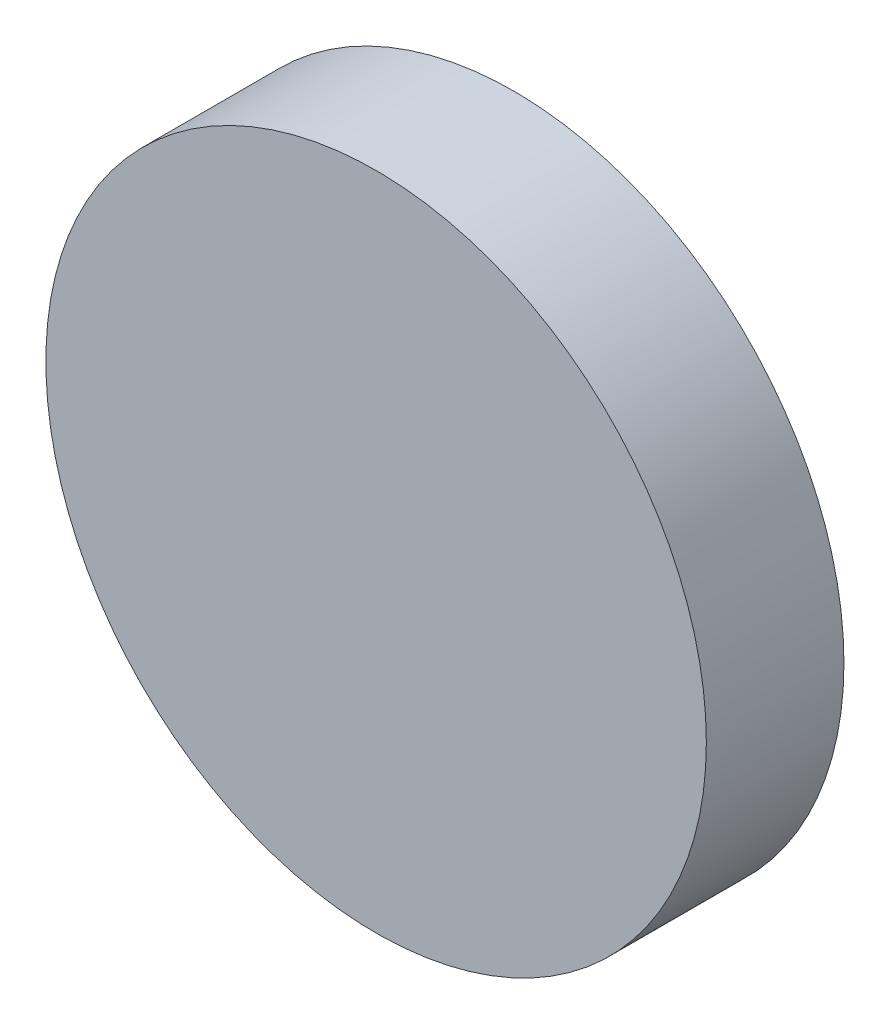
ISO-10303-21;
HEADER;
FILE_DESCRIPTION(('STEP AP214'),'2;1');
FILE_NAME('part.step','',(''),(''),'','','');
FILE_SCHEMA(('AUTOMOTIVE_DESIGN { 1 0 10303 214 1 1 1 1 }'));
ENDSEC;
DATA;
#1=APPLICATION_CONTEXT('core data for automotive mechanical design processes');
#2=APPLICATION_PROTOCOL_DEFINITION('international standard','automotive_design',2000,#1);
#3=PRODUCT_CONTEXT('',#1,'mechanical');
#4=PRODUCT('Part','Part','',(#3));
#5=PRODUCT_RELATED_PRODUCT_CATEGORY('part','',(#4));
#6=PRODUCT_DEFINITION_FORMATION('','',#4);
#7=PRODUCT_DEFINITION_CONTEXT('part definition',#1,'design');
#8=PRODUCT_DEFINITION('design','',#6,#7);
#9=PRODUCT_DEFINITION_SHAPE('','',#8);
#10=(LENGTH_UNIT() NAMED_UNIT(*) SI_UNIT(.MILLI.,.METRE.));
#11=(NAMED_UNIT(*) PLANE_ANGLE_UNIT() SI_UNIT($,.RADIAN.));
#12=(NAMED_UNIT(*) SI_UNIT($,.STERADIAN.) SOLID_ANGLE_UNIT());
#13=UNCERTAINTY_MEASURE_WITH_UNIT(LENGTH_MEASURE(1.E-05),#10,'distance_accuracy_value','');
#14=(GEOMETRIC_REPRESENTATION_CONTEXT(3) GLOBAL_UNCERTAINTY_ASSIGNED_CONTEXT((#13)) GLOBAL_UNIT_ASSIGNED_CONTEXT((#10,
#11,#12)) REPRESENTATION_CONTEXT('',''));
#15=CARTESIAN_POINT('',(0.,0.,0.));
#16=DIRECTION('',(0.,0.,1.));
#17=DIRECTION('',(1.,0.,0.));
#18=AXIS2_PLACEMENT_3D('',#15,#16,#17);
#19=CARTESIAN_POINT('',(0.,0.,10.));
#20=DIRECTION('',(0.,0.,-1.));
#21=DIRECTION('',(-1.,0.,0.));
#22=AXIS2_PLACEMENT_3D('',#19,#20,#21);
#23=CYLINDRICAL_SURFACE('',#22,24.);
#24=CARTESIAN_POINT('',(0.,0.,10.));
#25=DIRECTION('',(0.,0.,1.));
#26=DIRECTION('',(1.,0.,0.));
#27=AXIS2_PLACEMENT_3D('',#24,#25,#26);
#28=CIRCLE('',#27,24.);
#29=CARTESIAN_POINT('',(24.,0.,10.));
#30=VERTEX_POINT('',#29);
#31=EDGE_CURVE('E78',#30,#30,#28,.T.);
#32=ORIENTED_EDGE('',*,*,#31,.F.);
#33=EDGE_LOOP('',(#32));
#34=FACE_BOUND('',#33,.T.);
#35=CARTESIAN_POINT('',(0.,0.,0.));
#36=DIRECTION('',(0.,0.,1.));
#37=DIRECTION('',(1.,0.,0.));
#38=AXIS2_PLACEMENT_3D('',#35,#36,#37);
#39=CIRCLE('',#38,24.);
#40=CARTESIAN_POINT('',(24.,0.,0.));
#41=VERTEX_POINT('',#40);
#42=EDGE_CURVE('E79',#41,#41,#39,.T.);
#43=ORIENTED_EDGE('',*,*,#42,.T.);
#44=EDGE_LOOP('',(#43));
#45=FACE_BOUND('',#44,.T.);
#46=ADVANCED_FACE('F38',(#34,#45),#23,.T.);
#47=CARTESIAN_POINT('',(0.,0.,10.));
#48=DIRECTION('',(0.,0.,1.));
#49=DIRECTION('',(1.,0.,0.));
#50=AXIS2_PLACEMENT_3D('',#47,#48,#49);
#51=PLANE('',#50);
#52=ORIENTED_EDGE('',*,*,#31,.T.);
#53=EDGE_LOOP('',(#52));
#54=FACE_BOUND('',#53,.T.);
#55=ADVANCED_FACE('F85',(#54),#51,.T.);
#56=CARTESIAN_POINT('',(0.,0.,0.));
#57=DIRECTION('',(0.,0.,1.));
#58=DIRECTION('',(1.,0.,0.));
#59=AXIS2_PLACEMENT_3D('',#56,#57,#58);
#60=PLANE('',#59);
#61=CARTESIAN_POINT('',(15.8155664172263,-10.164047368165,0.));
#62=DIRECTION('',(0.,0.,1.));
#63=DIRECTION('',(1.,0.,0.));
#64=AXIS2_PLACEMENT_3D('',#61,#62,#63);
#65=CIRCLE('',#64,2.);
#66=CARTESIAN_POINT('',(17.8155664172263,-10.164047368165,0.));
#67=VERTEX_POINT('',#66);
#68=EDGE_CURVE('E11',#67,#67,#65,.F.);
#69=ORIENTED_EDGE('',*,*,#68,.F.);
#70=EDGE_LOOP('',(#69));
#71=FACE_BOUND('',#70,.T.);
#72=CARTESIAN_POINT('',(7.80980224443567,-17.1010815126649,0.));
#73=DIRECTION('',(0.,0.,1.));
#74=DIRECTION('',(1.,0.,0.));
#75=AXIS2_PLACEMENT_3D('',#72,#73,#74);
#76=CIRCLE('',#75,2.);
#77=CARTESIAN_POINT('',(9.80980224443567,-17.1010815126649,0.));
#78=VERTEX_POINT('',#77);
#79=EDGE_CURVE('E44',#78,#78,#76,.F.);
#80=ORIENTED_EDGE('',*,*,#79,.F.);
#81=EDGE_LOOP('',(#80));
#82=FACE_BOUND('',#81,.T.);
#83=CARTESIAN_POINT('',(-2.67551895953756,-18.6086431073616,0.));
#84=DIRECTION('',(0.,0.,1.));
#85=DIRECTION('',(1.,0.,0.));
#86=AXIS2_PLACEMENT_3D('',#83,#84,#85);
#87=CIRCLE('',#86,2.);
#88=CARTESIAN_POINT('',(-0.675518959537561,-18.6086431073616,0.));
#89=VERTEX_POINT('',#88);
#90=EDGE_CURVE('E48',#89,#89,#87,.F.);
#91=ORIENTED_EDGE('',*,*,#90,.F.);
#92=EDGE_LOOP('',(#91));
#93=FACE_BOUND('',#92,.T.);
#94=CARTESIAN_POINT('',(-12.3113817981712,-14.2080919978602,0.));
#95=DIRECTION('',(0.,0.,1.));
#96=DIRECTION('',(1.,0.,0.));
#97=AXIS2_PLACEMENT_3D('',#94,#95,#96);
#98=CIRCLE('',#97,2.);
#99=CARTESIAN_POINT('',(-10.3113817981712,-14.2080919978602,0.));
#100=VERTEX_POINT('',#99);
#101=EDGE_CURVE('E52',#100,#100,#98,.F.);
#102=ORIENTED_EDGE('',*,*,#101,.F.);
#103=EDGE_LOOP('',(#102));
#104=FACE_BOUND('',#103,.T.);
#105=CARTESIAN_POINT('',(-18.0384679039525,-5.29657206861902,0.));
#106=DIRECTION('',(0.,0.,1.));
#107=DIRECTION('',(1.,0.,0.));
#108=AXIS2_PLACEMENT_3D('',#105,#106,#107);
#109=CIRCLE('',#108,2.);
#110=CARTESIAN_POINT('',(-16.0384679039525,-5.29657206861902,0.));
#111=VERTEX_POINT('',#110);
#112=EDGE_CURVE('E57',#111,#111,#109,.F.);
#113=ORIENTED_EDGE('',*,*,#112,.F.);
#114=EDGE_LOOP('',(#113));
#115=FACE_BOUND('',#114,.T.);
#116=CARTESIAN_POINT('',(-18.0384679039526,5.29657206861876,0.));
#117=DIRECTION('',(0.,0.,1.));
#118=DIRECTION('',(1.,0.,0.));
#119=AXIS2_PLACEMENT_3D('',#116,#117,#118);
#120=CIRCLE('',#119,2.);
#121=CARTESIAN_POINT('',(-16.0384679039526,5.29657206861876,0.));
#122=VERTEX_POINT('',#121);
#123=EDGE_CURVE('E60',#122,#122,#120,.F.);
#124=ORIENTED_EDGE('',*,*,#123,.F.);
#125=EDGE_LOOP('',(#124));
#126=FACE_BOUND('',#125,.T.);
#127=CARTESIAN_POINT('',(-12.3113817981714,14.20809199786,0.));
#128=DIRECTION('',(0.,0.,1.));
#129=DIRECTION('',(1.,0.,0.));
#130=AXIS2_PLACEMENT_3D('',#127,#128,#129);
#131=CIRCLE('',#130,2.);
#132=CARTESIAN_POINT('',(-10.3113817981714,14.20809199786,0.));
#133=VERTEX_POINT('',#132);
#134=EDGE_CURVE('E63',#133,#133,#131,.F.);
#135=ORIENTED_EDGE('',*,*,#134,.F.);
#136=EDGE_LOOP('',(#135));
#137=FACE_BOUND('',#136,.T.);
#138=CARTESIAN_POINT('',(-2.67551895953783,18.6086431073615,0.));
#139=DIRECTION('',(0.,0.,1.));
#140=DIRECTION('',(1.,0.,0.));
#141=AXIS2_PLACEMENT_3D('',#138,#139,#140);
#142=CIRCLE('',#141,2.);
#143=CARTESIAN_POINT('',(-0.675518959537829,18.6086431073615,0.));
#144=VERTEX_POINT('',#143);
#145=EDGE_CURVE('E66',#144,#144,#142,.F.);
#146=ORIENTED_EDGE('',*,*,#145,.F.);
#147=EDGE_LOOP('',(#146));
#148=FACE_BOUND('',#147,.T.);
#149=CARTESIAN_POINT('',(7.80980224443542,17.101081512665,0.));
#150=DIRECTION('',(0.,0.,1.));
#151=DIRECTION('',(1.,0.,0.));
#152=AXIS2_PLACEMENT_3D('',#149,#150,#151);
#153=CIRCLE('',#152,2.);
#154=CARTESIAN_POINT('',(9.80980224443542,17.101081512665,0.));
#155=VERTEX_POINT('',#154);
#156=EDGE_CURVE('E69',#155,#155,#153,.F.);
#157=ORIENTED_EDGE('',*,*,#156,.F.);
#158=EDGE_LOOP('',(#157));
#159=FACE_BOUND('',#158,.T.);
#160=CARTESIAN_POINT('',(15.8155664172262,10.1640473681653,0.));
#161=DIRECTION('',(0.,0.,1.));
#162=DIRECTION('',(1.,0.,0.));
#163=AXIS2_PLACEMENT_3D('',#160,#161,#162);
#164=CIRCLE('',#163,2.);
#165=CARTESIAN_POINT('',(17.8155664172262,10.1640473681653,0.));
#166=VERTEX_POINT('',#165);
#167=EDGE_CURVE('E72',#166,#166,#164,.F.);
#168=ORIENTED_EDGE('',*,*,#167,.F.);
#169=EDGE_LOOP('',(#168));
#170=FACE_BOUND('',#169,.T.);
#171=CARTESIAN_POINT('',(18.8,0.,0.));
#172=DIRECTION('',(0.,0.,1.));
#173=DIRECTION('',(1.,0.,0.));
#174=AXIS2_PLACEMENT_3D('',#171,#172,#173);
#175=CIRCLE('',#174,2.);
#176=CARTESIAN_POINT('',(20.8,0.,0.));
#177=VERTEX_POINT('',#176);
#178=EDGE_CURVE('E75',#177,#177,#175,.F.);
#179=ORIENTED_EDGE('',*,*,#178,.F.);
#180=EDGE_LOOP('',(#179));
#181=FACE_BOUND('',#180,.T.);
#182=ORIENTED_EDGE('',*,*,#42,.F.);
#183=EDGE_LOOP('',(#182));
#184=FACE_BOUND('',#183,.T.);
#185=ADVANCED_FACE('F91',(#71,#82,#93,#104,#115,#126,#137,#148,#159,#170,#181,#184),#60,.F.);
#186=CARTESIAN_POINT('',(18.8,0.,0.));
#187=DIRECTION('',(0.,0.,-1.));
#188=DIRECTION('',(1.,0.,0.));
#189=AXIS2_PLACEMENT_3D('',#186,#187,#188);
#190=SPHERICAL_SURFACE('',#189,2.);
#191=ORIENTED_EDGE('',*,*,#178,.T.);
#192=EDGE_LOOP('',(#191));
#193=FACE_BOUND('',#192,.T.);
#194=ADVANCED_FACE('F93',(#193),#190,.T.);
#195=CARTESIAN_POINT('',(15.8155664172262,10.1640473681653,0.));
#196=DIRECTION('',(0.,0.,-1.));
#197=DIRECTION('',(0.841253532831181,0.540640817455599,0.));
#198=AXIS2_PLACEMENT_3D('',#195,#196,#197);
#199=SPHERICAL_SURFACE('',#198,2.);
#200=ORIENTED_EDGE('',*,*,#167,.T.);
#201=EDGE_LOOP('',(#200));
#202=FACE_BOUND('',#201,.T.);
#203=ADVANCED_FACE('F99',(#202),#199,.T.);
#204=CARTESIAN_POINT('',(7.80980224443542,17.101081512665,0.));
#205=DIRECTION('',(0.,0.,-1.));
#206=DIRECTION('',(0.415415013001884,0.909631995354519,0.));
#207=AXIS2_PLACEMENT_3D('',#204,#205,#206);
#208=SPHERICAL_SURFACE('',#207,2.);
#209=ORIENTED_EDGE('',*,*,#156,.T.);
#210=EDGE_LOOP('',(#209));
#211=FACE_BOUND('',#210,.T.);
#212=ADVANCED_FACE('F107',(#211),#208,.T.);
#213=CARTESIAN_POINT('',(-2.67551895953783,18.6086431073615,0.));
#214=DIRECTION('',(0.,0.,-1.));
#215=DIRECTION('',(-0.142314838273289,0.989821441880932,0.));
#216=AXIS2_PLACEMENT_3D('',#213,#214,#215);
#217=SPHERICAL_SURFACE('',#216,2.);
#218=ORIENTED_EDGE('',*,*,#145,.T.);
#219=EDGE_LOOP('',(#218));
#220=FACE_BOUND('',#219,.T.);
#221=ADVANCED_FACE('F111',(#220),#217,.T.);
#222=CARTESIAN_POINT('',(-12.3113817981714,14.20809199786,0.));
#223=DIRECTION('',(0.,0.,-1.));
#224=DIRECTION('',(-0.654860733945289,0.755749574354255,0.));
#225=AXIS2_PLACEMENT_3D('',#222,#223,#224);
#226=SPHERICAL_SURFACE('',#225,2.);
#227=ORIENTED_EDGE('',*,*,#134,.T.);
#228=EDGE_LOOP('',(#227));
#229=FACE_BOUND('',#228,.T.);
#230=ADVANCED_FACE('F115',(#229),#226,.T.);
#231=CARTESIAN_POINT('',(-18.0384679039526,5.29657206861876,0.));
#232=DIRECTION('',(0.,0.,-1.));
#233=DIRECTION('',(-0.959492973614499,0.281732556841423,0.));
#234=AXIS2_PLACEMENT_3D('',#231,#232,#233);
#235=SPHERICAL_SURFACE('',#234,2.);
#236=ORIENTED_EDGE('',*,*,#123,.T.);
#237=EDGE_LOOP('',(#236));
#238=FACE_BOUND('',#237,.T.);
#239=ADVANCED_FACE('F119',(#238),#235,.T.);
#240=CARTESIAN_POINT('',(-18.0384679039525,-5.29657206861902,0.));
#241=DIRECTION('',(0.,0.,-1.));
#242=DIRECTION('',(-0.959492973614495,-0.281732556841437,0.));
#243=AXIS2_PLACEMENT_3D('',#240,#241,#242);
#244=SPHERICAL_SURFACE('',#243,2.);
#245=ORIENTED_EDGE('',*,*,#112,.T.);
#246=EDGE_LOOP('',(#245));
#247=FACE_BOUND('',#246,.T.);
#248=ADVANCED_FACE('F123',(#247),#244,.T.);
#249=CARTESIAN_POINT('',(-12.3113817981712,-14.2080919978602,0.));
#250=DIRECTION('',(0.,0.,-1.));
#251=DIRECTION('',(-0.654860733945278,-0.755749574354264,0.));
#252=AXIS2_PLACEMENT_3D('',#249,#250,#251);
#253=SPHERICAL_SURFACE('',#252,2.);
#254=ORIENTED_EDGE('',*,*,#101,.T.);
#255=EDGE_LOOP('',(#254));
#256=FACE_BOUND('',#255,.T.);
#257=ADVANCED_FACE('F127',(#256),#253,.T.);
#258=CARTESIAN_POINT('',(-2.67551895953756,-18.6086431073616,0.));
#259=DIRECTION('',(0.,0.,-1.));
#260=DIRECTION('',(-0.142314838273275,-0.989821441880934,0.));
#261=AXIS2_PLACEMENT_3D('',#258,#259,#260);
#262=SPHERICAL_SURFACE('',#261,2.);
#263=ORIENTED_EDGE('',*,*,#90,.T.);
#264=EDGE_LOOP('',(#263));
#265=FACE_BOUND('',#264,.T.);
#266=ADVANCED_FACE('F131',(#265),#262,.T.);
#267=CARTESIAN_POINT('',(7.80980224443567,-17.1010815126649,0.));
#268=DIRECTION('',(0.,0.,-1.));
#269=DIRECTION('',(0.415415013001897,-0.909631995354513,0.));
#270=AXIS2_PLACEMENT_3D('',#267,#268,#269);
#271=SPHERICAL_SURFACE('',#270,2.);
#272=ORIENTED_EDGE('',*,*,#79,.T.);
#273=EDGE_LOOP('',(#272));
#274=FACE_BOUND('',#273,.T.);
#275=ADVANCED_FACE('F135',(#274),#271,.T.);
#276=CARTESIAN_POINT('',(15.8155664172263,-10.164047368165,0.));
#277=DIRECTION('',(0.,0.,-1.));
#278=DIRECTION('',(0.841253532831189,-0.540640817455586,0.));
#279=AXIS2_PLACEMENT_3D('',#276,#277,#278);
#280=SPHERICAL_SURFACE('',#279,2.);
#281=ORIENTED_EDGE('',*,*,#68,.T.);
#282=EDGE_LOOP('',(#281));
#283=FACE_BOUND('',#282,.T.);
#284=ADVANCED_FACE('F139',(#283),#280,.T.);
#285=CLOSED_SHELL('',(#46,#55,#185,#194,#203,#212,#221,#230,#239,#248,#257,#266,#275,#284));
#286=MANIFOLD_SOLID_BREP('B2',#285);
#287=ADVANCED_BREP_SHAPE_REPRESENTATION('',(#18,#286),#14);
#288=SHAPE_DEFINITION_REPRESENTATION(#9,#287);
ENDSEC;
END-ISO-10303-21;
